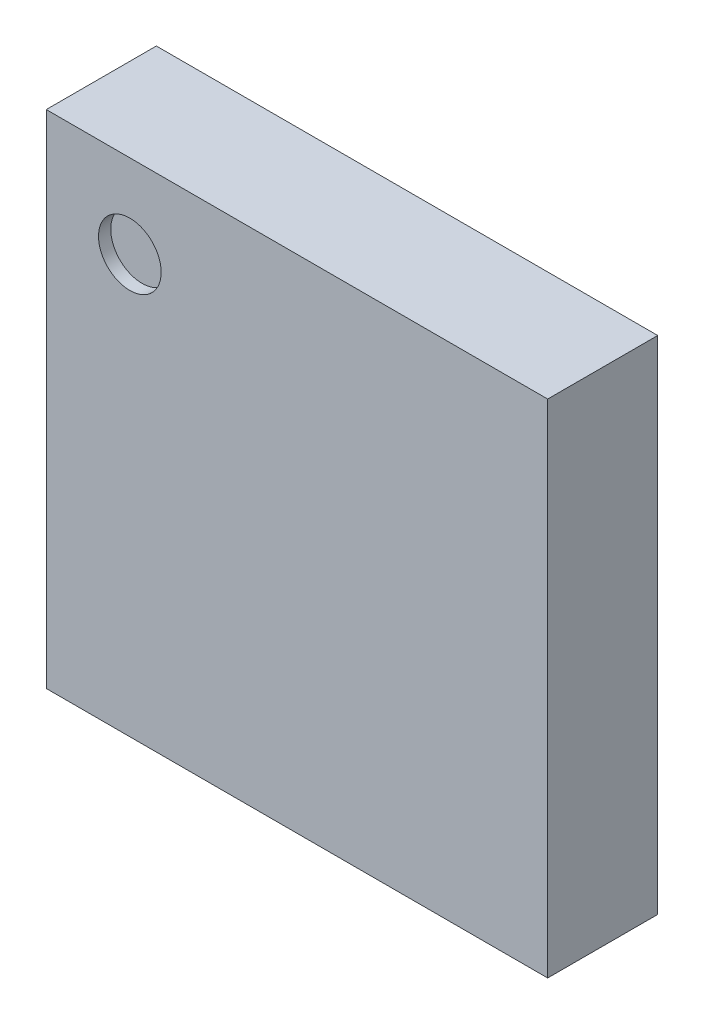
ISO-10303-21;
HEADER;
FILE_DESCRIPTION(('STEP AP214'),'2;1');
FILE_NAME('part.step','',(''),(''),'','','');
FILE_SCHEMA(('AUTOMOTIVE_DESIGN { 1 0 10303 214 1 1 1 1 }'));
ENDSEC;
DATA;
#1=APPLICATION_CONTEXT('core data for automotive mechanical design processes');
#2=APPLICATION_PROTOCOL_DEFINITION('international standard','automotive_design',2000,#1);
#3=PRODUCT_CONTEXT('',#1,'mechanical');
#4=PRODUCT('Part','Part','',(#3));
#5=PRODUCT_RELATED_PRODUCT_CATEGORY('part','',(#4));
#6=PRODUCT_DEFINITION_FORMATION('','',#4);
#7=PRODUCT_DEFINITION_CONTEXT('part definition',#1,'design');
#8=PRODUCT_DEFINITION('design','',#6,#7);
#9=PRODUCT_DEFINITION_SHAPE('','',#8);
#10=(LENGTH_UNIT() NAMED_UNIT(*) SI_UNIT(.MILLI.,.METRE.));
#11=(NAMED_UNIT(*) PLANE_ANGLE_UNIT() SI_UNIT($,.RADIAN.));
#12=(NAMED_UNIT(*) SI_UNIT($,.STERADIAN.) SOLID_ANGLE_UNIT());
#13=UNCERTAINTY_MEASURE_WITH_UNIT(LENGTH_MEASURE(1.E-05),#10,'distance_accuracy_value','');
#14=(GEOMETRIC_REPRESENTATION_CONTEXT(3) GLOBAL_UNCERTAINTY_ASSIGNED_CONTEXT((#13)) GLOBAL_UNIT_ASSIGNED_CONTEXT((#10,
#11,#12)) REPRESENTATION_CONTEXT('',''));
#15=CARTESIAN_POINT('',(0.,0.,0.));
#16=DIRECTION('',(0.,0.,1.));
#17=DIRECTION('',(1.,0.,0.));
#18=AXIS2_PLACEMENT_3D('',#15,#16,#17);
#19=CARTESIAN_POINT('',(0.683333333333,3.416666666667,0.8));
#20=DIRECTION('',(0.,0.,1.));
#21=DIRECTION('',(1.,0.,0.));
#22=AXIS2_PLACEMENT_3D('',#19,#20,#21);
#23=PLANE('',#22);
#24=CARTESIAN_POINT('',(0.683333333333,3.416666666667,0.8));
#25=DIRECTION('',(0.,0.,1.));
#26=DIRECTION('',(1.,0.,0.));
#27=AXIS2_PLACEMENT_3D('',#24,#25,#26);
#28=CIRCLE('',#27,0.25625);
#29=CARTESIAN_POINT('',(0.939583333333,3.416666666667,0.8));
#30=VERTEX_POINT('',#29);
#31=EDGE_CURVE('E19',#30,#30,#28,.T.);
#32=ORIENTED_EDGE('',*,*,#31,.T.);
#33=EDGE_LOOP('',(#32));
#34=FACE_BOUND('',#33,.T.);
#35=ADVANCED_FACE('F16',(#34),#23,.T.);
#36=CARTESIAN_POINT('',(0.683333333333,3.416666666667,0.8));
#37=DIRECTION('',(0.,0.,1.));
#38=DIRECTION('',(1.,0.,0.));
#39=AXIS2_PLACEMENT_3D('',#36,#37,#38);
#40=CYLINDRICAL_SURFACE('',#39,0.25625);
#41=CARTESIAN_POINT('',(0.683333333333,3.416666666667,0.9));
#42=DIRECTION('',(0.,0.,1.));
#43=DIRECTION('',(1.,0.,0.));
#44=AXIS2_PLACEMENT_3D('',#41,#42,#43);
#45=CIRCLE('',#44,0.25625);
#46=CARTESIAN_POINT('',(0.939583333333,3.416666666667,0.9));
#47=VERTEX_POINT('',#46);
#48=EDGE_CURVE('E65',#47,#47,#45,.F.);
#49=ORIENTED_EDGE('',*,*,#48,.F.);
#50=EDGE_LOOP('',(#49));
#51=FACE_BOUND('',#50,.T.);
#52=ORIENTED_EDGE('',*,*,#31,.F.);
#53=EDGE_LOOP('',(#52));
#54=FACE_BOUND('',#53,.T.);
#55=ADVANCED_FACE('F86',(#51,#54),#40,.F.);
#56=CARTESIAN_POINT('',(0.,0.,0.9));
#57=DIRECTION('',(0.,0.,1.));
#58=DIRECTION('',(1.,0.,0.));
#59=AXIS2_PLACEMENT_3D('',#56,#57,#58);
#60=PLANE('',#59);
#61=ORIENTED_EDGE('',*,*,#48,.T.);
#62=EDGE_LOOP('',(#61));
#63=FACE_BOUND('',#62,.T.);
#64=DIRECTION('',(0.,1.,0.));
#65=VECTOR('',#64,1.);
#66=CARTESIAN_POINT('',(4.1,0.,0.9));
#67=LINE('',#66,#65);
#68=CARTESIAN_POINT('',(4.1,4.1,0.9));
#69=VERTEX_POINT('',#68);
#70=CARTESIAN_POINT('',(4.1,0.,0.9));
#71=VERTEX_POINT('',#70);
#72=EDGE_CURVE('E165',#69,#71,#67,.F.);
#73=ORIENTED_EDGE('',*,*,#72,.F.);
#74=DIRECTION('',(1.,0.,0.));
#75=VECTOR('',#74,1.);
#76=CARTESIAN_POINT('',(0.,4.1,0.9));
#77=LINE('',#76,#75);
#78=CARTESIAN_POINT('',(0.,4.1,0.9));
#79=VERTEX_POINT('',#78);
#80=EDGE_CURVE('E59',#79,#69,#77,.T.);
#81=ORIENTED_EDGE('',*,*,#80,.F.);
#82=DIRECTION('',(0.,1.,0.));
#83=VECTOR('',#82,1.);
#84=CARTESIAN_POINT('',(0.,0.,0.9));
#85=LINE('',#84,#83);
#86=CARTESIAN_POINT('',(0.,0.,0.9));
#87=VERTEX_POINT('',#86);
#88=EDGE_CURVE('E57',#79,#87,#85,.F.);
#89=ORIENTED_EDGE('',*,*,#88,.T.);
#90=DIRECTION('',(1.,0.,0.));
#91=VECTOR('',#90,1.);
#92=CARTESIAN_POINT('',(0.,0.,0.9));
#93=LINE('',#92,#91);
#94=EDGE_CURVE('E54',#87,#71,#93,.T.);
#95=ORIENTED_EDGE('',*,*,#94,.T.);
#96=EDGE_LOOP('',(#73,#81,#89,#95));
#97=FACE_BOUND('',#96,.T.);
#98=ADVANCED_FACE('F58',(#63,#97),#60,.T.);
#99=CARTESIAN_POINT('',(0.,0.,0.));
#100=DIRECTION('',(1.,0.,0.));
#101=DIRECTION('',(0.,0.,-1.));
#102=AXIS2_PLACEMENT_3D('',#99,#100,#101);
#103=PLANE('',#102);
#104=DIRECTION('',(0.,0.,1.));
#105=VECTOR('',#104,1.);
#106=CARTESIAN_POINT('',(0.,4.1,0.));
#107=LINE('',#106,#105);
#108=CARTESIAN_POINT('',(0.,4.1,0.));
#109=VERTEX_POINT('',#108);
#110=EDGE_CURVE('E169',#109,#79,#107,.T.);
#111=ORIENTED_EDGE('',*,*,#110,.F.);
#112=DIRECTION('',(0.,1.,0.));
#113=VECTOR('',#112,1.);
#114=CARTESIAN_POINT('',(0.,0.,0.));
#115=LINE('',#114,#113);
#116=CARTESIAN_POINT('',(0.,0.,0.));
#117=VERTEX_POINT('',#116);
#118=EDGE_CURVE('E76',#109,#117,#115,.F.);
#119=ORIENTED_EDGE('',*,*,#118,.T.);
#120=DIRECTION('',(0.,0.,1.));
#121=VECTOR('',#120,1.);
#122=CARTESIAN_POINT('',(0.,0.,0.));
#123=LINE('',#122,#121);
#124=EDGE_CURVE('E64',#117,#87,#123,.T.);
#125=ORIENTED_EDGE('',*,*,#124,.T.);
#126=ORIENTED_EDGE('',*,*,#88,.F.);
#127=EDGE_LOOP('',(#111,#119,#125,#126));
#128=FACE_BOUND('',#127,.T.);
#129=ADVANCED_FACE('F75',(#128),#103,.F.);
#130=CARTESIAN_POINT('',(0.,0.,0.));
#131=DIRECTION('',(0.,1.,0.));
#132=DIRECTION('',(0.,0.,1.));
#133=AXIS2_PLACEMENT_3D('',#130,#131,#132);
#134=PLANE('',#133);
#135=ORIENTED_EDGE('',*,*,#94,.F.);
#136=ORIENTED_EDGE('',*,*,#124,.F.);
#137=DIRECTION('',(1.,0.,0.));
#138=VECTOR('',#137,1.);
#139=CARTESIAN_POINT('',(0.,0.,0.));
#140=LINE('',#139,#138);
#141=CARTESIAN_POINT('',(4.1,0.,0.));
#142=VERTEX_POINT('',#141);
#143=EDGE_CURVE('E167',#117,#142,#140,.T.);
#144=ORIENTED_EDGE('',*,*,#143,.T.);
#145=DIRECTION('',(0.,0.,-1.));
#146=VECTOR('',#145,1.);
#147=CARTESIAN_POINT('',(4.1,0.,0.));
#148=LINE('',#147,#146);
#149=EDGE_CURVE('E72',#71,#142,#148,.T.);
#150=ORIENTED_EDGE('',*,*,#149,.F.);
#151=EDGE_LOOP('',(#135,#136,#144,#150));
#152=FACE_BOUND('',#151,.T.);
#153=ADVANCED_FACE('F69',(#152),#134,.F.);
#154=CARTESIAN_POINT('',(4.1,0.,0.));
#155=DIRECTION('',(1.,0.,0.));
#156=DIRECTION('',(0.,0.,-1.));
#157=AXIS2_PLACEMENT_3D('',#154,#155,#156);
#158=PLANE('',#157);
#159=DIRECTION('',(0.,0.,1.));
#160=VECTOR('',#159,1.);
#161=CARTESIAN_POINT('',(4.1,4.1,0.));
#162=LINE('',#161,#160);
#163=CARTESIAN_POINT('',(4.1,4.1,0.));
#164=VERTEX_POINT('',#163);
#165=EDGE_CURVE('E33',#69,#164,#162,.F.);
#166=ORIENTED_EDGE('',*,*,#165,.F.);
#167=ORIENTED_EDGE('',*,*,#72,.T.);
#168=ORIENTED_EDGE('',*,*,#149,.T.);
#169=DIRECTION('',(0.,1.,0.));
#170=VECTOR('',#169,1.);
#171=CARTESIAN_POINT('',(4.1,0.,0.));
#172=LINE('',#171,#170);
#173=EDGE_CURVE('E25',#142,#164,#172,.T.);
#174=ORIENTED_EDGE('',*,*,#173,.T.);
#175=EDGE_LOOP('',(#166,#167,#168,#174));
#176=FACE_BOUND('',#175,.T.);
#177=ADVANCED_FACE('F103',(#176),#158,.T.);
#178=CARTESIAN_POINT('',(0.,4.1,0.));
#179=DIRECTION('',(0.,1.,0.));
#180=DIRECTION('',(0.,0.,1.));
#181=AXIS2_PLACEMENT_3D('',#178,#179,#180);
#182=PLANE('',#181);
#183=ORIENTED_EDGE('',*,*,#80,.T.);
#184=ORIENTED_EDGE('',*,*,#165,.T.);
#185=DIRECTION('',(1.,0.,0.));
#186=VECTOR('',#185,1.);
#187=CARTESIAN_POINT('',(0.,4.1,0.));
#188=LINE('',#187,#186);
#189=EDGE_CURVE('E11',#164,#109,#188,.F.);
#190=ORIENTED_EDGE('',*,*,#189,.T.);
#191=ORIENTED_EDGE('',*,*,#110,.T.);
#192=EDGE_LOOP('',(#183,#184,#190,#191));
#193=FACE_BOUND('',#192,.T.);
#194=ADVANCED_FACE('F97',(#193),#182,.T.);
#195=CARTESIAN_POINT('',(0.,0.,0.));
#196=DIRECTION('',(0.,0.,1.));
#197=DIRECTION('',(1.,0.,0.));
#198=AXIS2_PLACEMENT_3D('',#195,#196,#197);
#199=PLANE('',#198);
#200=ORIENTED_EDGE('',*,*,#173,.F.);
#201=ORIENTED_EDGE('',*,*,#143,.F.);
#202=ORIENTED_EDGE('',*,*,#118,.F.);
#203=ORIENTED_EDGE('',*,*,#189,.F.);
#204=EDGE_LOOP('',(#200,#201,#202,#203));
#205=FACE_BOUND('',#204,.T.);
#206=ADVANCED_FACE('F95',(#205),#199,.F.);
#207=CLOSED_SHELL('',(#35,#55,#98,#129,#153,#177,#194,#206));
#208=MANIFOLD_SOLID_BREP('B1',#207);
#209=ADVANCED_BREP_SHAPE_REPRESENTATION('',(#18,#208),#14);
#210=SHAPE_DEFINITION_REPRESENTATION(#9,#209);
ENDSEC;
END-ISO-10303-21;
